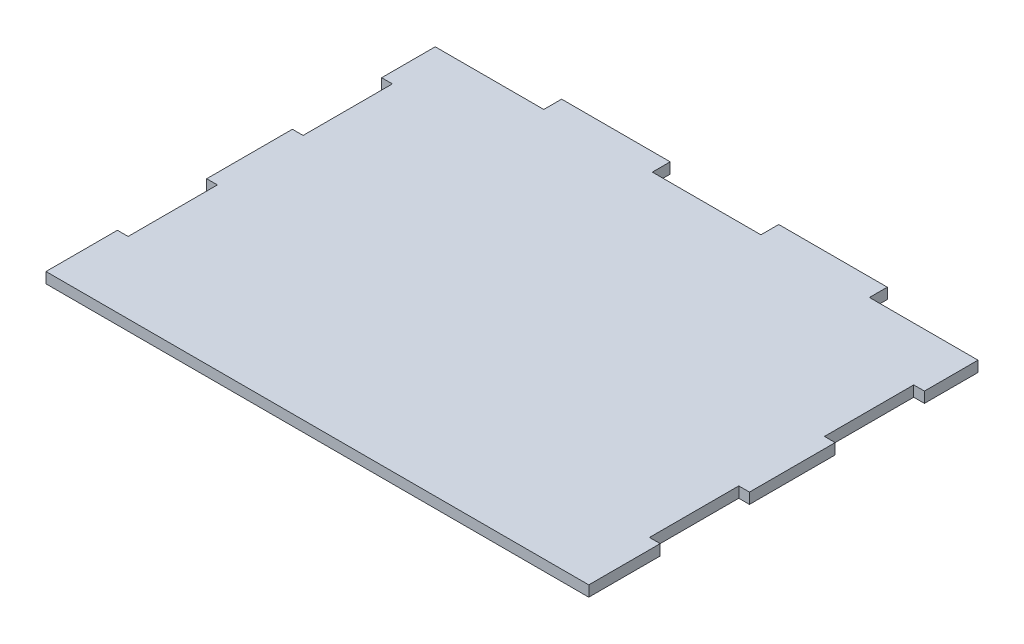
ISO-10303-21;
HEADER;
FILE_DESCRIPTION(('STEP AP214'),'2;1');
FILE_NAME('part.step','',(''),(''),'','','');
FILE_SCHEMA(('AUTOMOTIVE_DESIGN { 1 0 10303 214 1 1 1 1 }'));
ENDSEC;
DATA;
#1=APPLICATION_CONTEXT('core data for automotive mechanical design processes');
#2=APPLICATION_PROTOCOL_DEFINITION('international standard','automotive_design',2000,#1);
#3=PRODUCT_CONTEXT('',#1,'mechanical');
#4=PRODUCT('Part','Part','',(#3));
#5=PRODUCT_RELATED_PRODUCT_CATEGORY('part','',(#4));
#6=PRODUCT_DEFINITION_FORMATION('','',#4);
#7=PRODUCT_DEFINITION_CONTEXT('part definition',#1,'design');
#8=PRODUCT_DEFINITION('design','',#6,#7);
#9=PRODUCT_DEFINITION_SHAPE('','',#8);
#10=(LENGTH_UNIT() NAMED_UNIT(*) SI_UNIT(.MILLI.,.METRE.));
#11=(NAMED_UNIT(*) PLANE_ANGLE_UNIT() SI_UNIT($,.RADIAN.));
#12=(NAMED_UNIT(*) SI_UNIT($,.STERADIAN.) SOLID_ANGLE_UNIT());
#13=UNCERTAINTY_MEASURE_WITH_UNIT(LENGTH_MEASURE(1.E-05),#10,'distance_accuracy_value','');
#14=(GEOMETRIC_REPRESENTATION_CONTEXT(3) GLOBAL_UNCERTAINTY_ASSIGNED_CONTEXT((#13)) GLOBAL_UNIT_ASSIGNED_CONTEXT((#10,
#11,#12)) REPRESENTATION_CONTEXT('',''));
#15=CARTESIAN_POINT('',(0.,0.,0.));
#16=DIRECTION('',(0.,0.,1.));
#17=DIRECTION('',(1.,0.,0.));
#18=AXIS2_PLACEMENT_3D('',#15,#16,#17);
#19=CARTESIAN_POINT('',(-76.,3.,57.));
#20=DIRECTION('',(1.,0.,0.));
#21=DIRECTION('',(0.,0.,-1.));
#22=AXIS2_PLACEMENT_3D('',#19,#20,#21);
#23=PLANE('',#22);
#24=DIRECTION('',(0.,0.,1.));
#25=VECTOR('',#24,1.);
#26=CARTESIAN_POINT('',(-76.,0.,57.));
#27=LINE('',#26,#25);
#28=CARTESIAN_POINT('',(-76.,0.,37.));
#29=VERTEX_POINT('',#28);
#30=CARTESIAN_POINT('',(-76.,0.,57.));
#31=VERTEX_POINT('',#30);
#32=EDGE_CURVE('E174',#29,#31,#27,.T.);
#33=ORIENTED_EDGE('',*,*,#32,.T.);
#34=DIRECTION('',(0.,-1.,0.));
#35=VECTOR('',#34,1.);
#36=CARTESIAN_POINT('',(-76.,3.,57.));
#37=LINE('',#36,#35);
#38=CARTESIAN_POINT('',(-76.,3.,57.));
#39=VERTEX_POINT('',#38);
#40=EDGE_CURVE('E11',#39,#31,#37,.T.);
#41=ORIENTED_EDGE('',*,*,#40,.F.);
#42=DIRECTION('',(0.,0.,1.));
#43=VECTOR('',#42,1.);
#44=CARTESIAN_POINT('',(-76.,3.,57.));
#45=LINE('',#44,#43);
#46=CARTESIAN_POINT('',(-76.,3.,37.));
#47=VERTEX_POINT('',#46);
#48=EDGE_CURVE('E204',#47,#39,#45,.T.);
#49=ORIENTED_EDGE('',*,*,#48,.F.);
#50=DIRECTION('',(0.,-1.,0.));
#51=VECTOR('',#50,1.);
#52=CARTESIAN_POINT('',(-76.,3.,37.));
#53=LINE('',#52,#51);
#54=EDGE_CURVE('E170',#47,#29,#53,.T.);
#55=ORIENTED_EDGE('',*,*,#54,.T.);
#56=EDGE_LOOP('',(#33,#41,#49,#55));
#57=FACE_BOUND('',#56,.T.);
#58=ADVANCED_FACE('F37',(#57),#23,.F.);
#59=CARTESIAN_POINT('',(0.,3.,57.));
#60=DIRECTION('',(0.,0.,-1.));
#61=DIRECTION('',(-1.,0.,0.));
#62=AXIS2_PLACEMENT_3D('',#59,#60,#61);
#63=PLANE('',#62);
#64=DIRECTION('',(1.,0.,0.));
#65=VECTOR('',#64,1.);
#66=CARTESIAN_POINT('',(0.,0.,57.));
#67=LINE('',#66,#65);
#68=CARTESIAN_POINT('',(76.,0.,57.));
#69=VERTEX_POINT('',#68);
#70=EDGE_CURVE('E177',#31,#69,#67,.T.);
#71=ORIENTED_EDGE('',*,*,#70,.T.);
#72=DIRECTION('',(0.,-1.,0.));
#73=VECTOR('',#72,1.);
#74=CARTESIAN_POINT('',(76.,3.,57.));
#75=LINE('',#74,#73);
#76=CARTESIAN_POINT('',(76.,3.,57.));
#77=VERTEX_POINT('',#76);
#78=EDGE_CURVE('E659',#77,#69,#75,.T.);
#79=ORIENTED_EDGE('',*,*,#78,.F.);
#80=DIRECTION('',(1.,0.,0.));
#81=VECTOR('',#80,1.);
#82=CARTESIAN_POINT('',(0.,3.,57.));
#83=LINE('',#82,#81);
#84=EDGE_CURVE('E115',#39,#77,#83,.T.);
#85=ORIENTED_EDGE('',*,*,#84,.F.);
#86=ORIENTED_EDGE('',*,*,#40,.T.);
#87=EDGE_LOOP('',(#71,#79,#85,#86));
#88=FACE_BOUND('',#87,.T.);
#89=ADVANCED_FACE('F300',(#88),#63,.F.);
#90=CARTESIAN_POINT('',(-15.2,3.,-52.));
#91=DIRECTION('',(0.,0.,1.));
#92=DIRECTION('',(1.,0.,0.));
#93=AXIS2_PLACEMENT_3D('',#90,#91,#92);
#94=PLANE('',#93);
#95=DIRECTION('',(-1.,0.,0.));
#96=VECTOR('',#95,1.);
#97=CARTESIAN_POINT('',(-15.2,0.,-52.));
#98=LINE('',#97,#96);
#99=CARTESIAN_POINT('',(15.2,0.,-52.));
#100=VERTEX_POINT('',#99);
#101=CARTESIAN_POINT('',(-15.2,0.,-52.));
#102=VERTEX_POINT('',#101);
#103=EDGE_CURVE('E181',#100,#102,#98,.T.);
#104=ORIENTED_EDGE('',*,*,#103,.T.);
#105=DIRECTION('',(0.,-1.,0.));
#106=VECTOR('',#105,1.);
#107=CARTESIAN_POINT('',(-15.2,3.,-52.));
#108=LINE('',#107,#106);
#109=CARTESIAN_POINT('',(-15.2,3.,-52.));
#110=VERTEX_POINT('',#109);
#111=EDGE_CURVE('E45',#110,#102,#108,.T.);
#112=ORIENTED_EDGE('',*,*,#111,.F.);
#113=DIRECTION('',(-1.,0.,0.));
#114=VECTOR('',#113,1.);
#115=CARTESIAN_POINT('',(-15.2,3.,-52.));
#116=LINE('',#115,#114);
#117=CARTESIAN_POINT('',(15.2,3.,-52.));
#118=VERTEX_POINT('',#117);
#119=EDGE_CURVE('E699',#118,#110,#116,.T.);
#120=ORIENTED_EDGE('',*,*,#119,.F.);
#121=DIRECTION('',(0.,-1.,0.));
#122=VECTOR('',#121,1.);
#123=CARTESIAN_POINT('',(15.2,3.,-52.));
#124=LINE('',#123,#122);
#125=EDGE_CURVE('E642',#118,#100,#124,.T.);
#126=ORIENTED_EDGE('',*,*,#125,.T.);
#127=EDGE_LOOP('',(#104,#112,#120,#126));
#128=FACE_BOUND('',#127,.T.);
#129=ADVANCED_FACE('F304',(#128),#94,.F.);
#130=CARTESIAN_POINT('',(-15.2,3.,-57.));
#131=DIRECTION('',(-1.,0.,0.));
#132=DIRECTION('',(0.,0.,1.));
#133=AXIS2_PLACEMENT_3D('',#130,#131,#132);
#134=PLANE('',#133);
#135=DIRECTION('',(0.,0.,-1.));
#136=VECTOR('',#135,1.);
#137=CARTESIAN_POINT('',(-15.2,0.,-57.));
#138=LINE('',#137,#136);
#139=CARTESIAN_POINT('',(-15.2,0.,-57.));
#140=VERTEX_POINT('',#139);
#141=EDGE_CURVE('E183',#102,#140,#138,.T.);
#142=ORIENTED_EDGE('',*,*,#141,.T.);
#143=DIRECTION('',(0.,-1.,0.));
#144=VECTOR('',#143,1.);
#145=CARTESIAN_POINT('',(-15.2,3.,-57.));
#146=LINE('',#145,#144);
#147=CARTESIAN_POINT('',(-15.2,3.,-57.));
#148=VERTEX_POINT('',#147);
#149=EDGE_CURVE('E229',#148,#140,#146,.T.);
#150=ORIENTED_EDGE('',*,*,#149,.F.);
#151=DIRECTION('',(0.,0.,-1.));
#152=VECTOR('',#151,1.);
#153=CARTESIAN_POINT('',(-15.2,3.,-57.));
#154=LINE('',#153,#152);
#155=EDGE_CURVE('E238',#110,#148,#154,.T.);
#156=ORIENTED_EDGE('',*,*,#155,.F.);
#157=ORIENTED_EDGE('',*,*,#111,.T.);
#158=EDGE_LOOP('',(#142,#150,#156,#157));
#159=FACE_BOUND('',#158,.T.);
#160=ADVANCED_FACE('F236',(#159),#134,.F.);
#161=CARTESIAN_POINT('',(-45.6,3.,-57.));
#162=DIRECTION('',(0.,0.,1.));
#163=DIRECTION('',(1.,0.,0.));
#164=AXIS2_PLACEMENT_3D('',#161,#162,#163);
#165=PLANE('',#164);
#166=DIRECTION('',(-1.,0.,0.));
#167=VECTOR('',#166,1.);
#168=CARTESIAN_POINT('',(-45.6,0.,-57.));
#169=LINE('',#168,#167);
#170=CARTESIAN_POINT('',(-45.6,0.,-57.));
#171=VERTEX_POINT('',#170);
#172=EDGE_CURVE('E185',#140,#171,#169,.T.);
#173=ORIENTED_EDGE('',*,*,#172,.T.);
#174=DIRECTION('',(0.,-1.,0.));
#175=VECTOR('',#174,1.);
#176=CARTESIAN_POINT('',(-45.6,3.,-57.));
#177=LINE('',#176,#175);
#178=CARTESIAN_POINT('',(-45.6,3.,-57.));
#179=VERTEX_POINT('',#178);
#180=EDGE_CURVE('E226',#179,#171,#177,.T.);
#181=ORIENTED_EDGE('',*,*,#180,.F.);
#182=DIRECTION('',(-1.,0.,0.));
#183=VECTOR('',#182,1.);
#184=CARTESIAN_POINT('',(-45.6,3.,-57.));
#185=LINE('',#184,#183);
#186=EDGE_CURVE('E262',#148,#179,#185,.T.);
#187=ORIENTED_EDGE('',*,*,#186,.F.);
#188=ORIENTED_EDGE('',*,*,#149,.T.);
#189=EDGE_LOOP('',(#173,#181,#187,#188));
#190=FACE_BOUND('',#189,.T.);
#191=ADVANCED_FACE('F253',(#190),#165,.F.);
#192=CARTESIAN_POINT('',(-45.6,3.,-52.));
#193=DIRECTION('',(1.,0.,0.));
#194=DIRECTION('',(0.,0.,-1.));
#195=AXIS2_PLACEMENT_3D('',#192,#193,#194);
#196=PLANE('',#195);
#197=DIRECTION('',(0.,0.,1.));
#198=VECTOR('',#197,1.);
#199=CARTESIAN_POINT('',(-45.6,0.,-52.));
#200=LINE('',#199,#198);
#201=CARTESIAN_POINT('',(-45.6,0.,-52.));
#202=VERTEX_POINT('',#201);
#203=EDGE_CURVE('E187',#171,#202,#200,.T.);
#204=ORIENTED_EDGE('',*,*,#203,.T.);
#205=DIRECTION('',(0.,-1.,0.));
#206=VECTOR('',#205,1.);
#207=CARTESIAN_POINT('',(-45.6,3.,-52.));
#208=LINE('',#207,#206);
#209=CARTESIAN_POINT('',(-45.6,3.,-52.));
#210=VERTEX_POINT('',#209);
#211=EDGE_CURVE('E223',#210,#202,#208,.T.);
#212=ORIENTED_EDGE('',*,*,#211,.F.);
#213=DIRECTION('',(0.,0.,1.));
#214=VECTOR('',#213,1.);
#215=CARTESIAN_POINT('',(-45.6,3.,-52.));
#216=LINE('',#215,#214);
#217=EDGE_CURVE('E259',#179,#210,#216,.T.);
#218=ORIENTED_EDGE('',*,*,#217,.F.);
#219=ORIENTED_EDGE('',*,*,#180,.T.);
#220=EDGE_LOOP('',(#204,#212,#218,#219));
#221=FACE_BOUND('',#220,.T.);
#222=ADVANCED_FACE('F257',(#221),#196,.F.);
#223=CARTESIAN_POINT('',(-76.,3.,-52.));
#224=DIRECTION('',(0.,0.,1.));
#225=DIRECTION('',(1.,0.,0.));
#226=AXIS2_PLACEMENT_3D('',#223,#224,#225);
#227=PLANE('',#226);
#228=DIRECTION('',(-1.,0.,0.));
#229=VECTOR('',#228,1.);
#230=CARTESIAN_POINT('',(-76.,0.,-52.));
#231=LINE('',#230,#229);
#232=CARTESIAN_POINT('',(-76.,0.,-52.));
#233=VERTEX_POINT('',#232);
#234=EDGE_CURVE('E189',#202,#233,#231,.T.);
#235=ORIENTED_EDGE('',*,*,#234,.T.);
#236=DIRECTION('',(0.,-1.,0.));
#237=VECTOR('',#236,1.);
#238=CARTESIAN_POINT('',(-76.,3.,-52.));
#239=LINE('',#238,#237);
#240=CARTESIAN_POINT('',(-76.,3.,-52.));
#241=VERTEX_POINT('',#240);
#242=EDGE_CURVE('E220',#241,#233,#239,.T.);
#243=ORIENTED_EDGE('',*,*,#242,.F.);
#244=DIRECTION('',(-1.,0.,0.));
#245=VECTOR('',#244,1.);
#246=CARTESIAN_POINT('',(-76.,3.,-52.));
#247=LINE('',#246,#245);
#248=EDGE_CURVE('E261',#210,#241,#247,.T.);
#249=ORIENTED_EDGE('',*,*,#248,.F.);
#250=ORIENTED_EDGE('',*,*,#211,.T.);
#251=EDGE_LOOP('',(#235,#243,#249,#250));
#252=FACE_BOUND('',#251,.T.);
#253=ADVANCED_FACE('F316',(#252),#227,.F.);
#254=CARTESIAN_POINT('',(-76.,3.,-37.));
#255=DIRECTION('',(1.,0.,0.));
#256=DIRECTION('',(0.,0.,-1.));
#257=AXIS2_PLACEMENT_3D('',#254,#255,#256);
#258=PLANE('',#257);
#259=DIRECTION('',(0.,0.,1.));
#260=VECTOR('',#259,1.);
#261=CARTESIAN_POINT('',(-76.,0.,-37.));
#262=LINE('',#261,#260);
#263=CARTESIAN_POINT('',(-76.,0.,-37.));
#264=VERTEX_POINT('',#263);
#265=EDGE_CURVE('E191',#233,#264,#262,.T.);
#266=ORIENTED_EDGE('',*,*,#265,.T.);
#267=DIRECTION('',(0.,-1.,0.));
#268=VECTOR('',#267,1.);
#269=CARTESIAN_POINT('',(-76.,3.,-37.));
#270=LINE('',#269,#268);
#271=CARTESIAN_POINT('',(-76.,3.,-37.));
#272=VERTEX_POINT('',#271);
#273=EDGE_CURVE('E217',#272,#264,#270,.T.);
#274=ORIENTED_EDGE('',*,*,#273,.F.);
#275=DIRECTION('',(0.,0.,1.));
#276=VECTOR('',#275,1.);
#277=CARTESIAN_POINT('',(-76.,3.,-37.));
#278=LINE('',#277,#276);
#279=EDGE_CURVE('E264',#241,#272,#278,.T.);
#280=ORIENTED_EDGE('',*,*,#279,.F.);
#281=ORIENTED_EDGE('',*,*,#242,.T.);
#282=EDGE_LOOP('',(#266,#274,#280,#281));
#283=FACE_BOUND('',#282,.T.);
#284=ADVANCED_FACE('F319',(#283),#258,.F.);
#285=CARTESIAN_POINT('',(-73.,3.,-37.));
#286=DIRECTION('',(0.,0.,-1.));
#287=DIRECTION('',(-1.,0.,0.));
#288=AXIS2_PLACEMENT_3D('',#285,#286,#287);
#289=PLANE('',#288);
#290=DIRECTION('',(1.,0.,0.));
#291=VECTOR('',#290,1.);
#292=CARTESIAN_POINT('',(-73.,0.,-37.));
#293=LINE('',#292,#291);
#294=CARTESIAN_POINT('',(-73.,0.,-37.));
#295=VERTEX_POINT('',#294);
#296=EDGE_CURVE('E193',#264,#295,#293,.T.);
#297=ORIENTED_EDGE('',*,*,#296,.T.);
#298=DIRECTION('',(0.,-1.,0.));
#299=VECTOR('',#298,1.);
#300=CARTESIAN_POINT('',(-73.,3.,-37.));
#301=LINE('',#300,#299);
#302=CARTESIAN_POINT('',(-73.,3.,-37.));
#303=VERTEX_POINT('',#302);
#304=EDGE_CURVE('E214',#303,#295,#301,.T.);
#305=ORIENTED_EDGE('',*,*,#304,.F.);
#306=DIRECTION('',(1.,0.,0.));
#307=VECTOR('',#306,1.);
#308=CARTESIAN_POINT('',(-73.,3.,-37.));
#309=LINE('',#308,#307);
#310=EDGE_CURVE('E270',#272,#303,#309,.T.);
#311=ORIENTED_EDGE('',*,*,#310,.F.);
#312=ORIENTED_EDGE('',*,*,#273,.T.);
#313=EDGE_LOOP('',(#297,#305,#311,#312));
#314=FACE_BOUND('',#313,.T.);
#315=ADVANCED_FACE('F323',(#314),#289,.F.);
#316=CARTESIAN_POINT('',(-73.,3.,-12.));
#317=DIRECTION('',(1.,0.,0.));
#318=DIRECTION('',(0.,0.,-1.));
#319=AXIS2_PLACEMENT_3D('',#316,#317,#318);
#320=PLANE('',#319);
#321=DIRECTION('',(0.,0.,1.));
#322=VECTOR('',#321,1.);
#323=CARTESIAN_POINT('',(-73.,0.,-12.));
#324=LINE('',#323,#322);
#325=CARTESIAN_POINT('',(-73.,0.,-12.));
#326=VERTEX_POINT('',#325);
#327=EDGE_CURVE('E195',#295,#326,#324,.T.);
#328=ORIENTED_EDGE('',*,*,#327,.T.);
#329=DIRECTION('',(0.,-1.,0.));
#330=VECTOR('',#329,1.);
#331=CARTESIAN_POINT('',(-73.,3.,-12.));
#332=LINE('',#331,#330);
#333=CARTESIAN_POINT('',(-73.,3.,-12.));
#334=VERTEX_POINT('',#333);
#335=EDGE_CURVE('E211',#334,#326,#332,.T.);
#336=ORIENTED_EDGE('',*,*,#335,.F.);
#337=DIRECTION('',(0.,0.,1.));
#338=VECTOR('',#337,1.);
#339=CARTESIAN_POINT('',(-73.,3.,-12.));
#340=LINE('',#339,#338);
#341=EDGE_CURVE('E272',#303,#334,#340,.T.);
#342=ORIENTED_EDGE('',*,*,#341,.F.);
#343=ORIENTED_EDGE('',*,*,#304,.T.);
#344=EDGE_LOOP('',(#328,#336,#342,#343));
#345=FACE_BOUND('',#344,.T.);
#346=ADVANCED_FACE('F327',(#345),#320,.F.);
#347=CARTESIAN_POINT('',(-76.,3.,-12.));
#348=DIRECTION('',(0.,0.,1.));
#349=DIRECTION('',(1.,0.,0.));
#350=AXIS2_PLACEMENT_3D('',#347,#348,#349);
#351=PLANE('',#350);
#352=DIRECTION('',(-1.,0.,0.));
#353=VECTOR('',#352,1.);
#354=CARTESIAN_POINT('',(-76.,0.,-12.));
#355=LINE('',#354,#353);
#356=CARTESIAN_POINT('',(-76.,0.,-12.));
#357=VERTEX_POINT('',#356);
#358=EDGE_CURVE('E197',#326,#357,#355,.T.);
#359=ORIENTED_EDGE('',*,*,#358,.T.);
#360=DIRECTION('',(0.,-1.,0.));
#361=VECTOR('',#360,1.);
#362=CARTESIAN_POINT('',(-76.,3.,-12.));
#363=LINE('',#362,#361);
#364=CARTESIAN_POINT('',(-76.,3.,-12.));
#365=VERTEX_POINT('',#364);
#366=EDGE_CURVE('E208',#365,#357,#363,.T.);
#367=ORIENTED_EDGE('',*,*,#366,.F.);
#368=DIRECTION('',(-1.,0.,0.));
#369=VECTOR('',#368,1.);
#370=CARTESIAN_POINT('',(-76.,3.,-12.));
#371=LINE('',#370,#369);
#372=EDGE_CURVE('E274',#334,#365,#371,.T.);
#373=ORIENTED_EDGE('',*,*,#372,.F.);
#374=ORIENTED_EDGE('',*,*,#335,.T.);
#375=EDGE_LOOP('',(#359,#367,#373,#374));
#376=FACE_BOUND('',#375,.T.);
#377=ADVANCED_FACE('F280',(#376),#351,.F.);
#378=CARTESIAN_POINT('',(-76.,3.,12.));
#379=DIRECTION('',(1.,0.,0.));
#380=DIRECTION('',(0.,0.,-1.));
#381=AXIS2_PLACEMENT_3D('',#378,#379,#380);
#382=PLANE('',#381);
#383=DIRECTION('',(0.,0.,1.));
#384=VECTOR('',#383,1.);
#385=CARTESIAN_POINT('',(-76.,0.,12.));
#386=LINE('',#385,#384);
#387=CARTESIAN_POINT('',(-76.,0.,12.));
#388=VERTEX_POINT('',#387);
#389=EDGE_CURVE('E199',#357,#388,#386,.T.);
#390=ORIENTED_EDGE('',*,*,#389,.T.);
#391=DIRECTION('',(0.,-1.,0.));
#392=VECTOR('',#391,1.);
#393=CARTESIAN_POINT('',(-76.,3.,12.));
#394=LINE('',#393,#392);
#395=CARTESIAN_POINT('',(-76.,3.,12.));
#396=VERTEX_POINT('',#395);
#397=EDGE_CURVE('E165',#396,#388,#394,.T.);
#398=ORIENTED_EDGE('',*,*,#397,.F.);
#399=DIRECTION('',(0.,0.,1.));
#400=VECTOR('',#399,1.);
#401=CARTESIAN_POINT('',(-76.,3.,12.));
#402=LINE('',#401,#400);
#403=EDGE_CURVE('E156',#365,#396,#402,.T.);
#404=ORIENTED_EDGE('',*,*,#403,.F.);
#405=ORIENTED_EDGE('',*,*,#366,.T.);
#406=EDGE_LOOP('',(#390,#398,#404,#405));
#407=FACE_BOUND('',#406,.T.);
#408=ADVANCED_FACE('F284',(#407),#382,.F.);
#409=CARTESIAN_POINT('',(-73.,3.,12.));
#410=DIRECTION('',(0.,0.,-1.));
#411=DIRECTION('',(-1.,0.,0.));
#412=AXIS2_PLACEMENT_3D('',#409,#410,#411);
#413=PLANE('',#412);
#414=DIRECTION('',(1.,0.,0.));
#415=VECTOR('',#414,1.);
#416=CARTESIAN_POINT('',(-73.,0.,12.));
#417=LINE('',#416,#415);
#418=CARTESIAN_POINT('',(-73.,0.,12.));
#419=VERTEX_POINT('',#418);
#420=EDGE_CURVE('E164',#388,#419,#417,.T.);
#421=ORIENTED_EDGE('',*,*,#420,.T.);
#422=DIRECTION('',(0.,-1.,0.));
#423=VECTOR('',#422,1.);
#424=CARTESIAN_POINT('',(-73.,3.,12.));
#425=LINE('',#424,#423);
#426=CARTESIAN_POINT('',(-73.,3.,12.));
#427=VERTEX_POINT('',#426);
#428=EDGE_CURVE('E161',#427,#419,#425,.T.);
#429=ORIENTED_EDGE('',*,*,#428,.F.);
#430=DIRECTION('',(1.,0.,0.));
#431=VECTOR('',#430,1.);
#432=CARTESIAN_POINT('',(-73.,3.,12.));
#433=LINE('',#432,#431);
#434=EDGE_CURVE('E150',#396,#427,#433,.T.);
#435=ORIENTED_EDGE('',*,*,#434,.F.);
#436=ORIENTED_EDGE('',*,*,#397,.T.);
#437=EDGE_LOOP('',(#421,#429,#435,#436));
#438=FACE_BOUND('',#437,.T.);
#439=ADVANCED_FACE('F162',(#438),#413,.F.);
#440=CARTESIAN_POINT('',(-73.,3.,37.));
#441=DIRECTION('',(1.,0.,0.));
#442=DIRECTION('',(0.,0.,-1.));
#443=AXIS2_PLACEMENT_3D('',#440,#441,#442);
#444=PLANE('',#443);
#445=DIRECTION('',(0.,0.,1.));
#446=VECTOR('',#445,1.);
#447=CARTESIAN_POINT('',(-73.,0.,37.));
#448=LINE('',#447,#446);
#449=CARTESIAN_POINT('',(-73.,0.,37.));
#450=VERTEX_POINT('',#449);
#451=EDGE_CURVE('E101',#419,#450,#448,.T.);
#452=ORIENTED_EDGE('',*,*,#451,.T.);
#453=DIRECTION('',(0.,-1.,0.));
#454=VECTOR('',#453,1.);
#455=CARTESIAN_POINT('',(-73.,3.,37.));
#456=LINE('',#455,#454);
#457=CARTESIAN_POINT('',(-73.,3.,37.));
#458=VERTEX_POINT('',#457);
#459=EDGE_CURVE('E166',#458,#450,#456,.T.);
#460=ORIENTED_EDGE('',*,*,#459,.F.);
#461=DIRECTION('',(0.,0.,1.));
#462=VECTOR('',#461,1.);
#463=CARTESIAN_POINT('',(-73.,3.,37.));
#464=LINE('',#463,#462);
#465=EDGE_CURVE('E154',#427,#458,#464,.T.);
#466=ORIENTED_EDGE('',*,*,#465,.F.);
#467=ORIENTED_EDGE('',*,*,#428,.T.);
#468=EDGE_LOOP('',(#452,#460,#466,#467));
#469=FACE_BOUND('',#468,.T.);
#470=ADVANCED_FACE('F168',(#469),#444,.F.);
#471=CARTESIAN_POINT('',(-76.,3.,37.));
#472=DIRECTION('',(0.,0.,1.));
#473=DIRECTION('',(1.,0.,0.));
#474=AXIS2_PLACEMENT_3D('',#471,#472,#473);
#475=PLANE('',#474);
#476=DIRECTION('',(-1.,0.,0.));
#477=VECTOR('',#476,1.);
#478=CARTESIAN_POINT('',(-76.,0.,37.));
#479=LINE('',#478,#477);
#480=EDGE_CURVE('E107',#450,#29,#479,.T.);
#481=ORIENTED_EDGE('',*,*,#480,.T.);
#482=ORIENTED_EDGE('',*,*,#54,.F.);
#483=DIRECTION('',(-1.,0.,0.));
#484=VECTOR('',#483,1.);
#485=CARTESIAN_POINT('',(-76.,3.,37.));
#486=LINE('',#485,#484);
#487=EDGE_CURVE('E53',#458,#47,#486,.T.);
#488=ORIENTED_EDGE('',*,*,#487,.F.);
#489=ORIENTED_EDGE('',*,*,#459,.T.);
#490=EDGE_LOOP('',(#481,#482,#488,#489));
#491=FACE_BOUND('',#490,.T.);
#492=ADVANCED_FACE('F289',(#491),#475,.F.);
#493=CARTESIAN_POINT('',(0.,3.,0.));
#494=DIRECTION('',(0.,-1.,0.));
#495=DIRECTION('',(0.,0.,-1.));
#496=AXIS2_PLACEMENT_3D('',#493,#494,#495);
#497=PLANE('',#496);
#498=ORIENTED_EDGE('',*,*,#48,.T.);
#499=ORIENTED_EDGE('',*,*,#84,.T.);
#500=DIRECTION('',(0.,0.,1.));
#501=VECTOR('',#500,1.);
#502=CARTESIAN_POINT('',(76.,3.,57.));
#503=LINE('',#502,#501);
#504=CARTESIAN_POINT('',(76.,3.,37.));
#505=VERTEX_POINT('',#504);
#506=EDGE_CURVE('E649',#505,#77,#503,.T.);
#507=ORIENTED_EDGE('',*,*,#506,.F.);
#508=DIRECTION('',(1.,0.,0.));
#509=VECTOR('',#508,1.);
#510=CARTESIAN_POINT('',(76.,3.,37.));
#511=LINE('',#510,#509);
#512=CARTESIAN_POINT('',(73.,3.,37.));
#513=VERTEX_POINT('',#512);
#514=EDGE_CURVE('E653',#513,#505,#511,.T.);
#515=ORIENTED_EDGE('',*,*,#514,.F.);
#516=DIRECTION('',(0.,0.,1.));
#517=VECTOR('',#516,1.);
#518=CARTESIAN_POINT('',(73.,3.,37.));
#519=LINE('',#518,#517);
#520=CARTESIAN_POINT('',(73.,3.,12.));
#521=VERTEX_POINT('',#520);
#522=EDGE_CURVE('E794',#521,#513,#519,.T.);
#523=ORIENTED_EDGE('',*,*,#522,.F.);
#524=DIRECTION('',(-1.,0.,0.));
#525=VECTOR('',#524,1.);
#526=CARTESIAN_POINT('',(73.,3.,12.));
#527=LINE('',#526,#525);
#528=CARTESIAN_POINT('',(76.,3.,12.));
#529=VERTEX_POINT('',#528);
#530=EDGE_CURVE('E791',#529,#521,#527,.T.);
#531=ORIENTED_EDGE('',*,*,#530,.F.);
#532=DIRECTION('',(0.,0.,1.));
#533=VECTOR('',#532,1.);
#534=CARTESIAN_POINT('',(76.,3.,12.));
#535=LINE('',#534,#533);
#536=CARTESIAN_POINT('',(76.,3.,-12.));
#537=VERTEX_POINT('',#536);
#538=EDGE_CURVE('E788',#537,#529,#535,.T.);
#539=ORIENTED_EDGE('',*,*,#538,.F.);
#540=DIRECTION('',(1.,0.,0.));
#541=VECTOR('',#540,1.);
#542=CARTESIAN_POINT('',(76.,3.,-12.));
#543=LINE('',#542,#541);
#544=CARTESIAN_POINT('',(73.,3.,-12.));
#545=VERTEX_POINT('',#544);
#546=EDGE_CURVE('E785',#545,#537,#543,.T.);
#547=ORIENTED_EDGE('',*,*,#546,.F.);
#548=DIRECTION('',(0.,0.,1.));
#549=VECTOR('',#548,1.);
#550=CARTESIAN_POINT('',(73.,3.,-12.));
#551=LINE('',#550,#549);
#552=CARTESIAN_POINT('',(73.,3.,-37.));
#553=VERTEX_POINT('',#552);
#554=EDGE_CURVE('E782',#553,#545,#551,.T.);
#555=ORIENTED_EDGE('',*,*,#554,.F.);
#556=DIRECTION('',(-1.,0.,0.));
#557=VECTOR('',#556,1.);
#558=CARTESIAN_POINT('',(73.,3.,-37.));
#559=LINE('',#558,#557);
#560=CARTESIAN_POINT('',(76.,3.,-37.));
#561=VERTEX_POINT('',#560);
#562=EDGE_CURVE('E779',#561,#553,#559,.T.);
#563=ORIENTED_EDGE('',*,*,#562,.F.);
#564=DIRECTION('',(0.,0.,1.));
#565=VECTOR('',#564,1.);
#566=CARTESIAN_POINT('',(76.,3.,-37.));
#567=LINE('',#566,#565);
#568=CARTESIAN_POINT('',(76.,3.,-52.));
#569=VERTEX_POINT('',#568);
#570=EDGE_CURVE('E776',#569,#561,#567,.T.);
#571=ORIENTED_EDGE('',*,*,#570,.F.);
#572=DIRECTION('',(1.,0.,0.));
#573=VECTOR('',#572,1.);
#574=CARTESIAN_POINT('',(76.,3.,-52.));
#575=LINE('',#574,#573);
#576=CARTESIAN_POINT('',(45.6,3.,-52.));
#577=VERTEX_POINT('',#576);
#578=EDGE_CURVE('E773',#577,#569,#575,.T.);
#579=ORIENTED_EDGE('',*,*,#578,.F.);
#580=DIRECTION('',(0.,0.,1.));
#581=VECTOR('',#580,1.);
#582=CARTESIAN_POINT('',(45.6,3.,-52.));
#583=LINE('',#582,#581);
#584=CARTESIAN_POINT('',(45.6,3.,-57.));
#585=VERTEX_POINT('',#584);
#586=EDGE_CURVE('E771',#585,#577,#583,.T.);
#587=ORIENTED_EDGE('',*,*,#586,.F.);
#588=DIRECTION('',(1.,0.,0.));
#589=VECTOR('',#588,1.);
#590=CARTESIAN_POINT('',(45.6,3.,-57.));
#591=LINE('',#590,#589);
#592=CARTESIAN_POINT('',(15.2,3.,-57.));
#593=VERTEX_POINT('',#592);
#594=EDGE_CURVE('E733',#593,#585,#591,.T.);
#595=ORIENTED_EDGE('',*,*,#594,.F.);
#596=DIRECTION('',(0.,0.,-1.));
#597=VECTOR('',#596,1.);
#598=CARTESIAN_POINT('',(15.2,3.,-57.));
#599=LINE('',#598,#597);
#600=EDGE_CURVE('E662',#118,#593,#599,.T.);
#601=ORIENTED_EDGE('',*,*,#600,.F.);
#602=ORIENTED_EDGE('',*,*,#119,.T.);
#603=ORIENTED_EDGE('',*,*,#155,.T.);
#604=ORIENTED_EDGE('',*,*,#186,.T.);
#605=ORIENTED_EDGE('',*,*,#217,.T.);
#606=ORIENTED_EDGE('',*,*,#248,.T.);
#607=ORIENTED_EDGE('',*,*,#279,.T.);
#608=ORIENTED_EDGE('',*,*,#310,.T.);
#609=ORIENTED_EDGE('',*,*,#341,.T.);
#610=ORIENTED_EDGE('',*,*,#372,.T.);
#611=ORIENTED_EDGE('',*,*,#403,.T.);
#612=ORIENTED_EDGE('',*,*,#434,.T.);
#613=ORIENTED_EDGE('',*,*,#465,.T.);
#614=ORIENTED_EDGE('',*,*,#487,.T.);
#615=EDGE_LOOP('',(#498,#499,#507,#515,#523,#531,#539,#547,#555,#563,#571,#579,#587,#595,#601,
#602,#603,#604,#605,#606,#607,#608,#609,#610,#611,#612,#613,#614));
#616=FACE_BOUND('',#615,.T.);
#617=ADVANCED_FACE('F152',(#616),#497,.F.);
#618=CARTESIAN_POINT('',(0.,0.,0.));
#619=DIRECTION('',(0.,-1.,0.));
#620=DIRECTION('',(0.,0.,-1.));
#621=AXIS2_PLACEMENT_3D('',#618,#619,#620);
#622=PLANE('',#621);
#623=ORIENTED_EDGE('',*,*,#32,.F.);
#624=ORIENTED_EDGE('',*,*,#480,.F.);
#625=ORIENTED_EDGE('',*,*,#451,.F.);
#626=ORIENTED_EDGE('',*,*,#420,.F.);
#627=ORIENTED_EDGE('',*,*,#389,.F.);
#628=ORIENTED_EDGE('',*,*,#358,.F.);
#629=ORIENTED_EDGE('',*,*,#327,.F.);
#630=ORIENTED_EDGE('',*,*,#296,.F.);
#631=ORIENTED_EDGE('',*,*,#265,.F.);
#632=ORIENTED_EDGE('',*,*,#234,.F.);
#633=ORIENTED_EDGE('',*,*,#203,.F.);
#634=ORIENTED_EDGE('',*,*,#172,.F.);
#635=ORIENTED_EDGE('',*,*,#141,.F.);
#636=ORIENTED_EDGE('',*,*,#103,.F.);
#637=DIRECTION('',(0.,0.,-1.));
#638=VECTOR('',#637,1.);
#639=CARTESIAN_POINT('',(15.2,0.,-57.));
#640=LINE('',#639,#638);
#641=CARTESIAN_POINT('',(15.2,0.,-57.));
#642=VERTEX_POINT('',#641);
#643=EDGE_CURVE('E639',#100,#642,#640,.T.);
#644=ORIENTED_EDGE('',*,*,#643,.T.);
#645=DIRECTION('',(1.,0.,0.));
#646=VECTOR('',#645,1.);
#647=CARTESIAN_POINT('',(45.6,0.,-57.));
#648=LINE('',#647,#646);
#649=CARTESIAN_POINT('',(45.6,0.,-57.));
#650=VERTEX_POINT('',#649);
#651=EDGE_CURVE('E650',#642,#650,#648,.T.);
#652=ORIENTED_EDGE('',*,*,#651,.T.);
#653=DIRECTION('',(0.,0.,1.));
#654=VECTOR('',#653,1.);
#655=CARTESIAN_POINT('',(45.6,0.,-52.));
#656=LINE('',#655,#654);
#657=CARTESIAN_POINT('',(45.6,0.,-52.));
#658=VERTEX_POINT('',#657);
#659=EDGE_CURVE('E655',#650,#658,#656,.T.);
#660=ORIENTED_EDGE('',*,*,#659,.T.);
#661=DIRECTION('',(1.,0.,0.));
#662=VECTOR('',#661,1.);
#663=CARTESIAN_POINT('',(76.,0.,-52.));
#664=LINE('',#663,#662);
#665=CARTESIAN_POINT('',(76.,0.,-52.));
#666=VERTEX_POINT('',#665);
#667=EDGE_CURVE('E740',#658,#666,#664,.T.);
#668=ORIENTED_EDGE('',*,*,#667,.T.);
#669=DIRECTION('',(0.,0.,1.));
#670=VECTOR('',#669,1.);
#671=CARTESIAN_POINT('',(76.,0.,-37.));
#672=LINE('',#671,#670);
#673=CARTESIAN_POINT('',(76.,0.,-37.));
#674=VERTEX_POINT('',#673);
#675=EDGE_CURVE('E741',#666,#674,#672,.T.);
#676=ORIENTED_EDGE('',*,*,#675,.T.);
#677=DIRECTION('',(-1.,0.,0.));
#678=VECTOR('',#677,1.);
#679=CARTESIAN_POINT('',(73.,0.,-37.));
#680=LINE('',#679,#678);
#681=CARTESIAN_POINT('',(73.,0.,-37.));
#682=VERTEX_POINT('',#681);
#683=EDGE_CURVE('E746',#674,#682,#680,.T.);
#684=ORIENTED_EDGE('',*,*,#683,.T.);
#685=DIRECTION('',(0.,0.,1.));
#686=VECTOR('',#685,1.);
#687=CARTESIAN_POINT('',(73.,0.,-12.));
#688=LINE('',#687,#686);
#689=CARTESIAN_POINT('',(73.,0.,-12.));
#690=VERTEX_POINT('',#689);
#691=EDGE_CURVE('E749',#682,#690,#688,.T.);
#692=ORIENTED_EDGE('',*,*,#691,.T.);
#693=DIRECTION('',(1.,0.,0.));
#694=VECTOR('',#693,1.);
#695=CARTESIAN_POINT('',(76.,0.,-12.));
#696=LINE('',#695,#694);
#697=CARTESIAN_POINT('',(76.,0.,-12.));
#698=VERTEX_POINT('',#697);
#699=EDGE_CURVE('E752',#690,#698,#696,.T.);
#700=ORIENTED_EDGE('',*,*,#699,.T.);
#701=DIRECTION('',(0.,0.,1.));
#702=VECTOR('',#701,1.);
#703=CARTESIAN_POINT('',(76.,0.,12.));
#704=LINE('',#703,#702);
#705=CARTESIAN_POINT('',(76.,0.,12.));
#706=VERTEX_POINT('',#705);
#707=EDGE_CURVE('E755',#698,#706,#704,.T.);
#708=ORIENTED_EDGE('',*,*,#707,.T.);
#709=DIRECTION('',(-1.,0.,0.));
#710=VECTOR('',#709,1.);
#711=CARTESIAN_POINT('',(73.,0.,12.));
#712=LINE('',#711,#710);
#713=CARTESIAN_POINT('',(73.,0.,12.));
#714=VERTEX_POINT('',#713);
#715=EDGE_CURVE('E758',#706,#714,#712,.T.);
#716=ORIENTED_EDGE('',*,*,#715,.T.);
#717=DIRECTION('',(0.,0.,1.));
#718=VECTOR('',#717,1.);
#719=CARTESIAN_POINT('',(73.,0.,37.));
#720=LINE('',#719,#718);
#721=CARTESIAN_POINT('',(73.,0.,37.));
#722=VERTEX_POINT('',#721);
#723=EDGE_CURVE('E761',#714,#722,#720,.T.);
#724=ORIENTED_EDGE('',*,*,#723,.T.);
#725=DIRECTION('',(1.,0.,0.));
#726=VECTOR('',#725,1.);
#727=CARTESIAN_POINT('',(76.,0.,37.));
#728=LINE('',#727,#726);
#729=CARTESIAN_POINT('',(76.,0.,37.));
#730=VERTEX_POINT('',#729);
#731=EDGE_CURVE('E764',#722,#730,#728,.T.);
#732=ORIENTED_EDGE('',*,*,#731,.T.);
#733=DIRECTION('',(0.,0.,1.));
#734=VECTOR('',#733,1.);
#735=CARTESIAN_POINT('',(76.,0.,57.));
#736=LINE('',#735,#734);
#737=EDGE_CURVE('E767',#730,#69,#736,.T.);
#738=ORIENTED_EDGE('',*,*,#737,.T.);
#739=ORIENTED_EDGE('',*,*,#70,.F.);
#740=EDGE_LOOP('',(#623,#624,#625,#626,#627,#628,#629,#630,#631,#632,#633,#634,#635,#636,#644,
#652,#660,#668,#676,#684,#692,#700,#708,#716,#724,#732,#738,#739));
#741=FACE_BOUND('',#740,.T.);
#742=ADVANCED_FACE('F245',(#741),#622,.T.);
#743=CARTESIAN_POINT('',(76.,3.,57.));
#744=DIRECTION('',(1.,0.,0.));
#745=DIRECTION('',(0.,0.,-1.));
#746=AXIS2_PLACEMENT_3D('',#743,#744,#745);
#747=PLANE('',#746);
#748=ORIENTED_EDGE('',*,*,#737,.F.);
#749=DIRECTION('',(0.,-1.,0.));
#750=VECTOR('',#749,1.);
#751=CARTESIAN_POINT('',(76.,3.,37.));
#752=LINE('',#751,#750);
#753=EDGE_CURVE('E178',#505,#730,#752,.T.);
#754=ORIENTED_EDGE('',*,*,#753,.F.);
#755=ORIENTED_EDGE('',*,*,#506,.T.);
#756=ORIENTED_EDGE('',*,*,#78,.T.);
#757=EDGE_LOOP('',(#748,#754,#755,#756));
#758=FACE_BOUND('',#757,.T.);
#759=ADVANCED_FACE('F380',(#758),#747,.T.);
#760=CARTESIAN_POINT('',(76.,3.,37.));
#761=DIRECTION('',(0.,0.,-1.));
#762=DIRECTION('',(-1.,0.,0.));
#763=AXIS2_PLACEMENT_3D('',#760,#761,#762);
#764=PLANE('',#763);
#765=ORIENTED_EDGE('',*,*,#731,.F.);
#766=DIRECTION('',(0.,-1.,0.));
#767=VECTOR('',#766,1.);
#768=CARTESIAN_POINT('',(73.,3.,37.));
#769=LINE('',#768,#767);
#770=EDGE_CURVE('E692',#513,#722,#769,.T.);
#771=ORIENTED_EDGE('',*,*,#770,.F.);
#772=ORIENTED_EDGE('',*,*,#514,.T.);
#773=ORIENTED_EDGE('',*,*,#753,.T.);
#774=EDGE_LOOP('',(#765,#771,#772,#773));
#775=FACE_BOUND('',#774,.T.);
#776=ADVANCED_FACE('F388',(#775),#764,.T.);
#777=CARTESIAN_POINT('',(73.,3.,37.));
#778=DIRECTION('',(1.,0.,0.));
#779=DIRECTION('',(0.,0.,-1.));
#780=AXIS2_PLACEMENT_3D('',#777,#778,#779);
#781=PLANE('',#780);
#782=ORIENTED_EDGE('',*,*,#723,.F.);
#783=DIRECTION('',(0.,-1.,0.));
#784=VECTOR('',#783,1.);
#785=CARTESIAN_POINT('',(73.,3.,12.));
#786=LINE('',#785,#784);
#787=EDGE_CURVE('E689',#521,#714,#786,.T.);
#788=ORIENTED_EDGE('',*,*,#787,.F.);
#789=ORIENTED_EDGE('',*,*,#522,.T.);
#790=ORIENTED_EDGE('',*,*,#770,.T.);
#791=EDGE_LOOP('',(#782,#788,#789,#790));
#792=FACE_BOUND('',#791,.T.);
#793=ADVANCED_FACE('F399',(#792),#781,.T.);
#794=CARTESIAN_POINT('',(73.,3.,12.));
#795=DIRECTION('',(0.,0.,1.));
#796=DIRECTION('',(1.,0.,0.));
#797=AXIS2_PLACEMENT_3D('',#794,#795,#796);
#798=PLANE('',#797);
#799=ORIENTED_EDGE('',*,*,#715,.F.);
#800=DIRECTION('',(0.,-1.,0.));
#801=VECTOR('',#800,1.);
#802=CARTESIAN_POINT('',(76.,3.,12.));
#803=LINE('',#802,#801);
#804=EDGE_CURVE('E686',#529,#706,#803,.T.);
#805=ORIENTED_EDGE('',*,*,#804,.F.);
#806=ORIENTED_EDGE('',*,*,#530,.T.);
#807=ORIENTED_EDGE('',*,*,#787,.T.);
#808=EDGE_LOOP('',(#799,#805,#806,#807));
#809=FACE_BOUND('',#808,.T.);
#810=ADVANCED_FACE('F410',(#809),#798,.T.);
#811=CARTESIAN_POINT('',(76.,3.,12.));
#812=DIRECTION('',(1.,0.,0.));
#813=DIRECTION('',(0.,0.,-1.));
#814=AXIS2_PLACEMENT_3D('',#811,#812,#813);
#815=PLANE('',#814);
#816=ORIENTED_EDGE('',*,*,#707,.F.);
#817=DIRECTION('',(0.,-1.,0.));
#818=VECTOR('',#817,1.);
#819=CARTESIAN_POINT('',(76.,3.,-12.));
#820=LINE('',#819,#818);
#821=EDGE_CURVE('E683',#537,#698,#820,.T.);
#822=ORIENTED_EDGE('',*,*,#821,.F.);
#823=ORIENTED_EDGE('',*,*,#538,.T.);
#824=ORIENTED_EDGE('',*,*,#804,.T.);
#825=EDGE_LOOP('',(#816,#822,#823,#824));
#826=FACE_BOUND('',#825,.T.);
#827=ADVANCED_FACE('F421',(#826),#815,.T.);
#828=CARTESIAN_POINT('',(76.,3.,-12.));
#829=DIRECTION('',(0.,0.,-1.));
#830=DIRECTION('',(-1.,0.,0.));
#831=AXIS2_PLACEMENT_3D('',#828,#829,#830);
#832=PLANE('',#831);
#833=ORIENTED_EDGE('',*,*,#699,.F.);
#834=DIRECTION('',(0.,-1.,0.));
#835=VECTOR('',#834,1.);
#836=CARTESIAN_POINT('',(73.,3.,-12.));
#837=LINE('',#836,#835);
#838=EDGE_CURVE('E680',#545,#690,#837,.T.);
#839=ORIENTED_EDGE('',*,*,#838,.F.);
#840=ORIENTED_EDGE('',*,*,#546,.T.);
#841=ORIENTED_EDGE('',*,*,#821,.T.);
#842=EDGE_LOOP('',(#833,#839,#840,#841));
#843=FACE_BOUND('',#842,.T.);
#844=ADVANCED_FACE('F432',(#843),#832,.T.);
#845=CARTESIAN_POINT('',(73.,3.,-12.));
#846=DIRECTION('',(1.,0.,0.));
#847=DIRECTION('',(0.,0.,-1.));
#848=AXIS2_PLACEMENT_3D('',#845,#846,#847);
#849=PLANE('',#848);
#850=ORIENTED_EDGE('',*,*,#691,.F.);
#851=DIRECTION('',(0.,-1.,0.));
#852=VECTOR('',#851,1.);
#853=CARTESIAN_POINT('',(73.,3.,-37.));
#854=LINE('',#853,#852);
#855=EDGE_CURVE('E677',#553,#682,#854,.T.);
#856=ORIENTED_EDGE('',*,*,#855,.F.);
#857=ORIENTED_EDGE('',*,*,#554,.T.);
#858=ORIENTED_EDGE('',*,*,#838,.T.);
#859=EDGE_LOOP('',(#850,#856,#857,#858));
#860=FACE_BOUND('',#859,.T.);
#861=ADVANCED_FACE('F443',(#860),#849,.T.);
#862=CARTESIAN_POINT('',(73.,3.,-37.));
#863=DIRECTION('',(0.,0.,1.));
#864=DIRECTION('',(1.,0.,0.));
#865=AXIS2_PLACEMENT_3D('',#862,#863,#864);
#866=PLANE('',#865);
#867=ORIENTED_EDGE('',*,*,#683,.F.);
#868=DIRECTION('',(0.,-1.,0.));
#869=VECTOR('',#868,1.);
#870=CARTESIAN_POINT('',(76.,3.,-37.));
#871=LINE('',#870,#869);
#872=EDGE_CURVE('E674',#561,#674,#871,.T.);
#873=ORIENTED_EDGE('',*,*,#872,.F.);
#874=ORIENTED_EDGE('',*,*,#562,.T.);
#875=ORIENTED_EDGE('',*,*,#855,.T.);
#876=EDGE_LOOP('',(#867,#873,#874,#875));
#877=FACE_BOUND('',#876,.T.);
#878=ADVANCED_FACE('F454',(#877),#866,.T.);
#879=CARTESIAN_POINT('',(76.,3.,-37.));
#880=DIRECTION('',(1.,0.,0.));
#881=DIRECTION('',(0.,0.,-1.));
#882=AXIS2_PLACEMENT_3D('',#879,#880,#881);
#883=PLANE('',#882);
#884=ORIENTED_EDGE('',*,*,#675,.F.);
#885=DIRECTION('',(0.,-1.,0.));
#886=VECTOR('',#885,1.);
#887=CARTESIAN_POINT('',(76.,3.,-52.));
#888=LINE('',#887,#886);
#889=EDGE_CURVE('E671',#569,#666,#888,.T.);
#890=ORIENTED_EDGE('',*,*,#889,.F.);
#891=ORIENTED_EDGE('',*,*,#570,.T.);
#892=ORIENTED_EDGE('',*,*,#872,.T.);
#893=EDGE_LOOP('',(#884,#890,#891,#892));
#894=FACE_BOUND('',#893,.T.);
#895=ADVANCED_FACE('F465',(#894),#883,.T.);
#896=CARTESIAN_POINT('',(76.,3.,-52.));
#897=DIRECTION('',(0.,0.,-1.));
#898=DIRECTION('',(-1.,0.,0.));
#899=AXIS2_PLACEMENT_3D('',#896,#897,#898);
#900=PLANE('',#899);
#901=ORIENTED_EDGE('',*,*,#667,.F.);
#902=DIRECTION('',(0.,-1.,0.));
#903=VECTOR('',#902,1.);
#904=CARTESIAN_POINT('',(45.6,3.,-52.));
#905=LINE('',#904,#903);
#906=EDGE_CURVE('E668',#577,#658,#905,.T.);
#907=ORIENTED_EDGE('',*,*,#906,.F.);
#908=ORIENTED_EDGE('',*,*,#578,.T.);
#909=ORIENTED_EDGE('',*,*,#889,.T.);
#910=EDGE_LOOP('',(#901,#907,#908,#909));
#911=FACE_BOUND('',#910,.T.);
#912=ADVANCED_FACE('F476',(#911),#900,.T.);
#913=CARTESIAN_POINT('',(45.6,3.,-52.));
#914=DIRECTION('',(1.,0.,0.));
#915=DIRECTION('',(0.,0.,-1.));
#916=AXIS2_PLACEMENT_3D('',#913,#914,#915);
#917=PLANE('',#916);
#918=ORIENTED_EDGE('',*,*,#659,.F.);
#919=DIRECTION('',(0.,-1.,0.));
#920=VECTOR('',#919,1.);
#921=CARTESIAN_POINT('',(45.6,3.,-57.));
#922=LINE('',#921,#920);
#923=EDGE_CURVE('E665',#585,#650,#922,.T.);
#924=ORIENTED_EDGE('',*,*,#923,.F.);
#925=ORIENTED_EDGE('',*,*,#586,.T.);
#926=ORIENTED_EDGE('',*,*,#906,.T.);
#927=EDGE_LOOP('',(#918,#924,#925,#926));
#928=FACE_BOUND('',#927,.T.);
#929=ADVANCED_FACE('F487',(#928),#917,.T.);
#930=CARTESIAN_POINT('',(45.6,3.,-57.));
#931=DIRECTION('',(0.,0.,-1.));
#932=DIRECTION('',(-1.,0.,0.));
#933=AXIS2_PLACEMENT_3D('',#930,#931,#932);
#934=PLANE('',#933);
#935=ORIENTED_EDGE('',*,*,#651,.F.);
#936=DIRECTION('',(0.,-1.,0.));
#937=VECTOR('',#936,1.);
#938=CARTESIAN_POINT('',(15.2,3.,-57.));
#939=LINE('',#938,#937);
#940=EDGE_CURVE('E646',#593,#642,#939,.T.);
#941=ORIENTED_EDGE('',*,*,#940,.F.);
#942=ORIENTED_EDGE('',*,*,#594,.T.);
#943=ORIENTED_EDGE('',*,*,#923,.T.);
#944=EDGE_LOOP('',(#935,#941,#942,#943));
#945=FACE_BOUND('',#944,.T.);
#946=ADVANCED_FACE('F498',(#945),#934,.T.);
#947=CARTESIAN_POINT('',(15.2,3.,-57.));
#948=DIRECTION('',(-1.,0.,0.));
#949=DIRECTION('',(0.,0.,1.));
#950=AXIS2_PLACEMENT_3D('',#947,#948,#949);
#951=PLANE('',#950);
#952=ORIENTED_EDGE('',*,*,#643,.F.);
#953=ORIENTED_EDGE('',*,*,#125,.F.);
#954=ORIENTED_EDGE('',*,*,#600,.T.);
#955=ORIENTED_EDGE('',*,*,#940,.T.);
#956=EDGE_LOOP('',(#952,#953,#954,#955));
#957=FACE_BOUND('',#956,.T.);
#958=ADVANCED_FACE('F509',(#957),#951,.T.);
#959=CLOSED_SHELL('',(#58,#89,#129,#160,#191,#222,#253,#284,#315,#346,#377,#408,#439,#470,#492,
#617,#742,#759,#776,#793,#810,#827,#844,#861,#878,#895,#912,#929,#946,#958));
#960=MANIFOLD_SOLID_BREP('B2',#959);
#961=ADVANCED_BREP_SHAPE_REPRESENTATION('',(#18,#960),#14);
#962=SHAPE_DEFINITION_REPRESENTATION(#9,#961);
ENDSEC;
END-ISO-10303-21;
